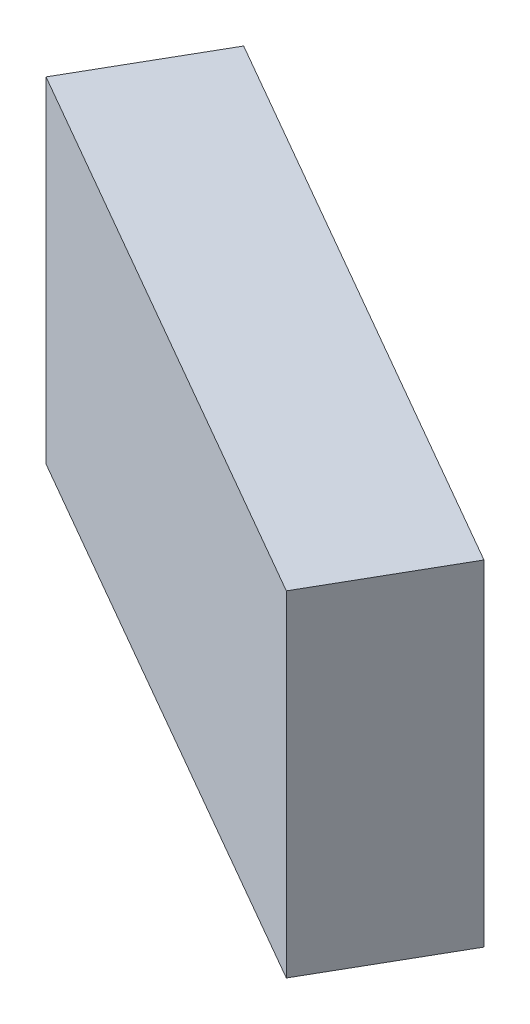
ISO-10303-21;
HEADER;
FILE_DESCRIPTION(('STEP AP214'),'2;1');
FILE_NAME('part.step','',(''),(''),'','','');
FILE_SCHEMA(('AUTOMOTIVE_DESIGN { 1 0 10303 214 1 1 1 1 }'));
ENDSEC;
DATA;
#1=APPLICATION_CONTEXT('core data for automotive mechanical design processes');
#2=APPLICATION_PROTOCOL_DEFINITION('international standard','automotive_design',2000,#1);
#3=PRODUCT_CONTEXT('',#1,'mechanical');
#4=PRODUCT('Part','Part','',(#3));
#5=PRODUCT_RELATED_PRODUCT_CATEGORY('part','',(#4));
#6=PRODUCT_DEFINITION_FORMATION('','',#4);
#7=PRODUCT_DEFINITION_CONTEXT('part definition',#1,'design');
#8=PRODUCT_DEFINITION('design','',#6,#7);
#9=PRODUCT_DEFINITION_SHAPE('','',#8);
#10=(LENGTH_UNIT() NAMED_UNIT(*) SI_UNIT(.MILLI.,.METRE.));
#11=(NAMED_UNIT(*) PLANE_ANGLE_UNIT() SI_UNIT($,.RADIAN.));
#12=(NAMED_UNIT(*) SI_UNIT($,.STERADIAN.) SOLID_ANGLE_UNIT());
#13=UNCERTAINTY_MEASURE_WITH_UNIT(LENGTH_MEASURE(1.E-05),#10,'distance_accuracy_value','');
#14=(GEOMETRIC_REPRESENTATION_CONTEXT(3) GLOBAL_UNCERTAINTY_ASSIGNED_CONTEXT((#13)) GLOBAL_UNIT_ASSIGNED_CONTEXT((#10,
#11,#12)) REPRESENTATION_CONTEXT('',''));
#15=CARTESIAN_POINT('',(0.,0.,0.));
#16=DIRECTION('',(0.,0.,1.));
#17=DIRECTION('',(1.,0.,0.));
#18=AXIS2_PLACEMENT_3D('',#15,#16,#17);
#19=CARTESIAN_POINT('',(-8.42481404212149,8.128,13.6480549242927));
#20=DIRECTION('',(0.498390486218656,0.,-0.866952664940094));
#21=DIRECTION('',(-0.866952664940094,0.,-0.498390486218656));
#22=AXIS2_PLACEMENT_3D('',#19,#20,#21);
#23=PLANE('',#22);
#24=DIRECTION('',(0.866952664940096,0.,0.498390486218653));
#25=VECTOR('',#24,1.);
#26=CARTESIAN_POINT('',(-8.42481404212149,8.128,13.6480549242927));
#27=LINE('',#26,#25);
#28=CARTESIAN_POINT('',(-8.42481404212149,8.128,13.6480549242927));
#29=VERTEX_POINT('',#28);
#30=CARTESIAN_POINT('',(-7.56831030280525,8.128,14.1404385714615));
#31=VERTEX_POINT('',#30);
#32=EDGE_CURVE('E55',#29,#31,#27,.T.);
#33=ORIENTED_EDGE('',*,*,#32,.T.);
#34=DIRECTION('',(0.,1.,0.));
#35=VECTOR('',#34,1.);
#36=CARTESIAN_POINT('',(-7.56831030280525,8.128,14.1404385714615));
#37=LINE('',#36,#35);
#38=CARTESIAN_POINT('',(-7.56831030280525,7.62,14.1404385714615));
#39=VERTEX_POINT('',#38);
#40=EDGE_CURVE('E67',#39,#31,#37,.T.);
#41=ORIENTED_EDGE('',*,*,#40,.F.);
#42=DIRECTION('',(0.866952664940096,0.,0.498390486218653));
#43=VECTOR('',#42,1.);
#44=CARTESIAN_POINT('',(-8.42481404212149,7.62,13.6480549242927));
#45=LINE('',#44,#43);
#46=CARTESIAN_POINT('',(-8.42481404212149,7.62,13.6480549242927));
#47=VERTEX_POINT('',#46);
#48=EDGE_CURVE('E20',#47,#39,#45,.T.);
#49=ORIENTED_EDGE('',*,*,#48,.F.);
#50=DIRECTION('',(0.,1.,0.));
#51=VECTOR('',#50,1.);
#52=CARTESIAN_POINT('',(-8.42481404212148,8.128,13.6480549242927));
#53=LINE('',#52,#51);
#54=EDGE_CURVE('E81',#29,#47,#53,.F.);
#55=ORIENTED_EDGE('',*,*,#54,.F.);
#56=EDGE_LOOP('',(#33,#41,#49,#55));
#57=FACE_BOUND('',#56,.T.);
#58=ADVANCED_FACE('F17',(#57),#23,.T.);
#59=CARTESIAN_POINT('',(-8.42481404212149,7.62,13.6480549242927));
#60=DIRECTION('',(0.,-1.,0.));
#61=DIRECTION('',(0.,0.,-1.));
#62=AXIS2_PLACEMENT_3D('',#59,#60,#61);
#63=PLANE('',#62);
#64=DIRECTION('',(0.497699254278926,0.,-0.86734967129192));
#65=VECTOR('',#64,1.);
#66=CARTESIAN_POINT('',(-7.56831030280525,7.62,14.1404385714615));
#67=LINE('',#66,#65);
#68=CARTESIAN_POINT('',(-7.67749332898047,7.62,14.3307138452329));
#69=VERTEX_POINT('',#68);
#70=EDGE_CURVE('E62',#69,#39,#67,.T.);
#71=ORIENTED_EDGE('',*,*,#70,.F.);
#72=DIRECTION('',(0.866952664940094,0.,0.498390486218656));
#73=VECTOR('',#72,1.);
#74=CARTESIAN_POINT('',(-7.67749332898047,7.62,14.3307138452329));
#75=LINE('',#74,#73);
#76=CARTESIAN_POINT('',(-8.53399706829671,7.62,13.8383301980641));
#77=VERTEX_POINT('',#76);
#78=EDGE_CURVE('E83',#77,#69,#75,.T.);
#79=ORIENTED_EDGE('',*,*,#78,.F.);
#80=DIRECTION('',(-0.497699254278926,0.,0.86734967129192));
#81=VECTOR('',#80,1.);
#82=CARTESIAN_POINT('',(-8.53399706829671,7.62,13.8383301980641));
#83=LINE('',#82,#81);
#84=EDGE_CURVE('E65',#47,#77,#83,.T.);
#85=ORIENTED_EDGE('',*,*,#84,.F.);
#86=ORIENTED_EDGE('',*,*,#48,.T.);
#87=EDGE_LOOP('',(#71,#79,#85,#86));
#88=FACE_BOUND('',#87,.T.);
#89=ADVANCED_FACE('F60',(#88),#63,.T.);
#90=CARTESIAN_POINT('',(-7.56831030280525,8.128,14.1404385714615));
#91=DIRECTION('',(0.86734967129192,0.,0.497699254278926));
#92=DIRECTION('',(0.497699254278926,0.,-0.86734967129192));
#93=AXIS2_PLACEMENT_3D('',#90,#91,#92);
#94=PLANE('',#93);
#95=DIRECTION('',(-0.497699254278888,0.,0.867349671291941));
#96=VECTOR('',#95,1.);
#97=CARTESIAN_POINT('',(-7.56831030280525,8.128,14.1404385714615));
#98=LINE('',#97,#96);
#99=CARTESIAN_POINT('',(-7.67749332898047,8.128,14.3307138452329));
#100=VERTEX_POINT('',#99);
#101=EDGE_CURVE('E77',#31,#100,#98,.T.);
#102=ORIENTED_EDGE('',*,*,#101,.T.);
#103=DIRECTION('',(0.,1.,0.));
#104=VECTOR('',#103,1.);
#105=CARTESIAN_POINT('',(-7.67749332898047,8.128,14.3307138452329));
#106=LINE('',#105,#104);
#107=EDGE_CURVE('E73',#69,#100,#106,.T.);
#108=ORIENTED_EDGE('',*,*,#107,.F.);
#109=ORIENTED_EDGE('',*,*,#70,.T.);
#110=ORIENTED_EDGE('',*,*,#40,.T.);
#111=EDGE_LOOP('',(#102,#108,#109,#110));
#112=FACE_BOUND('',#111,.T.);
#113=ADVANCED_FACE('F71',(#112),#94,.T.);
#114=CARTESIAN_POINT('',(-8.42481404212149,8.128,13.6480549242927));
#115=DIRECTION('',(0.,-1.,0.));
#116=DIRECTION('',(0.,0.,-1.));
#117=AXIS2_PLACEMENT_3D('',#114,#115,#116);
#118=PLANE('',#117);
#119=DIRECTION('',(0.866952664940094,0.,0.498390486218656));
#120=VECTOR('',#119,1.);
#121=CARTESIAN_POINT('',(-7.67749332898047,8.128,14.3307138452329));
#122=LINE('',#121,#120);
#123=CARTESIAN_POINT('',(-8.53399706829671,8.128,13.8383301980641));
#124=VERTEX_POINT('',#123);
#125=EDGE_CURVE('E26',#100,#124,#122,.F.);
#126=ORIENTED_EDGE('',*,*,#125,.F.);
#127=ORIENTED_EDGE('',*,*,#101,.F.);
#128=ORIENTED_EDGE('',*,*,#32,.F.);
#129=DIRECTION('',(-0.497699254278926,0.,0.86734967129192));
#130=VECTOR('',#129,1.);
#131=CARTESIAN_POINT('',(-8.53399706829671,8.128,13.8383301980641));
#132=LINE('',#131,#130);
#133=EDGE_CURVE('E35',#124,#29,#132,.F.);
#134=ORIENTED_EDGE('',*,*,#133,.F.);
#135=EDGE_LOOP('',(#126,#127,#128,#134));
#136=FACE_BOUND('',#135,.T.);
#137=ADVANCED_FACE('F89',(#136),#118,.F.);
#138=CARTESIAN_POINT('',(-8.53399706829671,8.128,13.8383301980641));
#139=DIRECTION('',(-0.86734967129192,0.,-0.497699254278926));
#140=DIRECTION('',(-0.497699254278926,0.,0.86734967129192));
#141=AXIS2_PLACEMENT_3D('',#138,#139,#140);
#142=PLANE('',#141);
#143=ORIENTED_EDGE('',*,*,#133,.T.);
#144=ORIENTED_EDGE('',*,*,#54,.T.);
#145=ORIENTED_EDGE('',*,*,#84,.T.);
#146=DIRECTION('',(0.,1.,0.));
#147=VECTOR('',#146,1.);
#148=CARTESIAN_POINT('',(-8.53399706829671,8.128,13.8383301980641));
#149=LINE('',#148,#147);
#150=EDGE_CURVE('E11',#124,#77,#149,.F.);
#151=ORIENTED_EDGE('',*,*,#150,.F.);
#152=EDGE_LOOP('',(#143,#144,#145,#151));
#153=FACE_BOUND('',#152,.T.);
#154=ADVANCED_FACE('F91',(#153),#142,.T.);
#155=CARTESIAN_POINT('',(-7.67749332898047,8.128,14.3307138452329));
#156=DIRECTION('',(-0.498390486218656,0.,0.866952664940094));
#157=DIRECTION('',(0.866952664940094,0.,0.498390486218656));
#158=AXIS2_PLACEMENT_3D('',#155,#156,#157);
#159=PLANE('',#158);
#160=ORIENTED_EDGE('',*,*,#125,.T.);
#161=ORIENTED_EDGE('',*,*,#150,.T.);
#162=ORIENTED_EDGE('',*,*,#78,.T.);
#163=ORIENTED_EDGE('',*,*,#107,.T.);
#164=EDGE_LOOP('',(#160,#161,#162,#163));
#165=FACE_BOUND('',#164,.T.);
#166=ADVANCED_FACE('F88',(#165),#159,.T.);
#167=CLOSED_SHELL('',(#58,#89,#113,#137,#154,#166));
#168=MANIFOLD_SOLID_BREP('B1',#167);
#169=ADVANCED_BREP_SHAPE_REPRESENTATION('',(#18,#168),#14);
#170=SHAPE_DEFINITION_REPRESENTATION(#9,#169);
ENDSEC;
END-ISO-10303-21;
